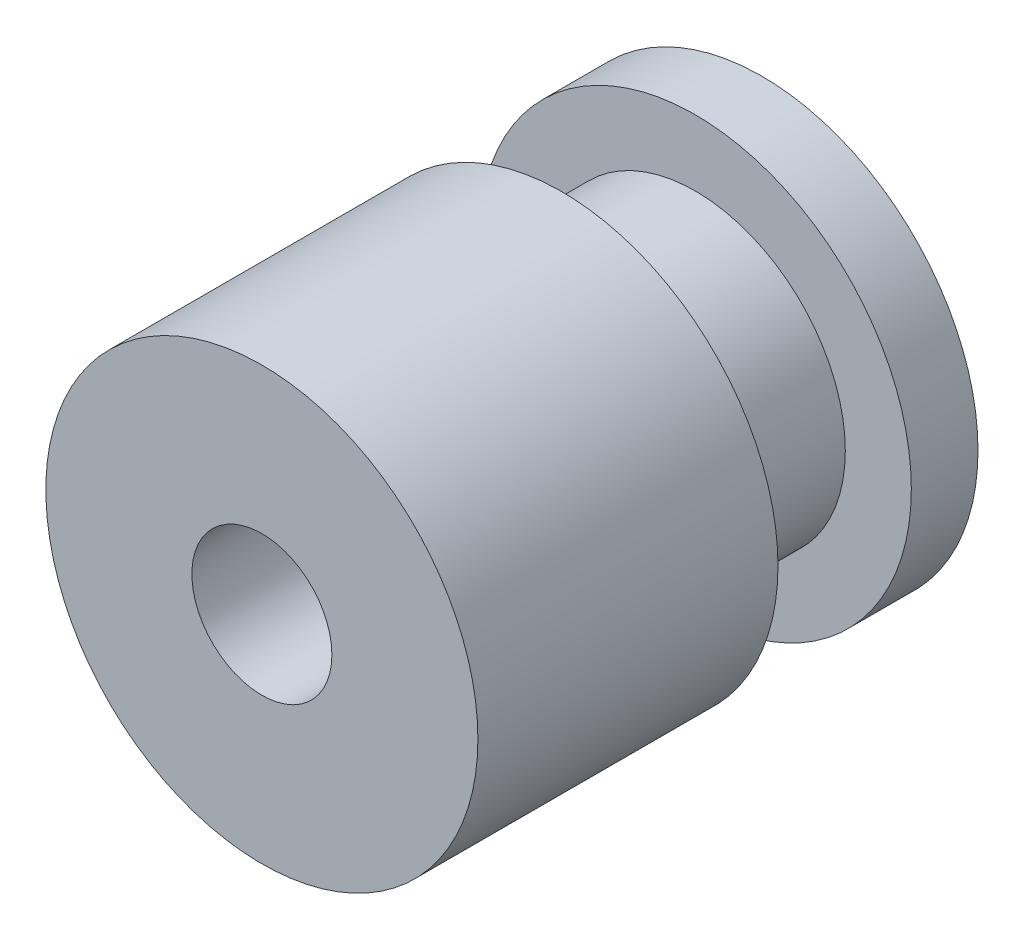
ISO-10303-21;
HEADER;
FILE_DESCRIPTION(('STEP AP214'),'2;1');
FILE_NAME('part.step','',(''),(''),'','','');
FILE_SCHEMA(('AUTOMOTIVE_DESIGN { 1 0 10303 214 1 1 1 1 }'));
ENDSEC;
DATA;
#1=APPLICATION_CONTEXT('core data for automotive mechanical design processes');
#2=APPLICATION_PROTOCOL_DEFINITION('international standard','automotive_design',2000,#1);
#3=PRODUCT_CONTEXT('',#1,'mechanical');
#4=PRODUCT('Part','Part','',(#3));
#5=PRODUCT_RELATED_PRODUCT_CATEGORY('part','',(#4));
#6=PRODUCT_DEFINITION_FORMATION('','',#4);
#7=PRODUCT_DEFINITION_CONTEXT('part definition',#1,'design');
#8=PRODUCT_DEFINITION('design','',#6,#7);
#9=PRODUCT_DEFINITION_SHAPE('','',#8);
#10=(LENGTH_UNIT() NAMED_UNIT(*) SI_UNIT(.MILLI.,.METRE.));
#11=(NAMED_UNIT(*) PLANE_ANGLE_UNIT() SI_UNIT($,.RADIAN.));
#12=(NAMED_UNIT(*) SI_UNIT($,.STERADIAN.) SOLID_ANGLE_UNIT());
#13=UNCERTAINTY_MEASURE_WITH_UNIT(LENGTH_MEASURE(1.E-05),#10,'distance_accuracy_value','');
#14=(GEOMETRIC_REPRESENTATION_CONTEXT(3) GLOBAL_UNCERTAINTY_ASSIGNED_CONTEXT((#13)) GLOBAL_UNIT_ASSIGNED_CONTEXT((#10,
#11,#12)) REPRESENTATION_CONTEXT('',''));
#15=CARTESIAN_POINT('',(0.,0.,0.));
#16=DIRECTION('',(0.,0.,1.));
#17=DIRECTION('',(1.,0.,0.));
#18=AXIS2_PLACEMENT_3D('',#15,#16,#17);
#19=CARTESIAN_POINT('',(6.48,0.,2.));
#20=DIRECTION('',(0.,0.,1.));
#21=DIRECTION('',(1.,0.,0.));
#22=AXIS2_PLACEMENT_3D('',#19,#20,#21);
#23=PLANE('',#22);
#24=CARTESIAN_POINT('',(0.,0.,2.));
#25=DIRECTION('',(0.,0.,1.));
#26=DIRECTION('',(1.,0.,0.));
#27=AXIS2_PLACEMENT_3D('',#24,#25,#26);
#28=CIRCLE('',#27,4.5);
#29=CARTESIAN_POINT('',(4.5,0.,2.));
#30=VERTEX_POINT('',#29);
#31=EDGE_CURVE('E63',#30,#30,#28,.T.);
#32=ORIENTED_EDGE('',*,*,#31,.F.);
#33=EDGE_LOOP('',(#32));
#34=FACE_BOUND('',#33,.T.);
#35=ADVANCED_FACE('F45',(#34),#23,.F.);
#36=CARTESIAN_POINT('',(0.,0.,7.6));
#37=DIRECTION('',(0.,0.,1.));
#38=DIRECTION('',(1.,0.,0.));
#39=AXIS2_PLACEMENT_3D('',#36,#37,#38);
#40=CONICAL_SURFACE('',#39,2.1,1.02974425867665);
#41=CARTESIAN_POINT('',(0.,0.,6.33819270004212));
#42=VERTEX_POINT('',#41);
#43=VERTEX_LOOP('',#42);
#44=FACE_BOUND('',#43,.T.);
#45=CARTESIAN_POINT('',(0.,0.,7.6));
#46=DIRECTION('',(0.,0.,1.));
#47=DIRECTION('',(1.,0.,0.));
#48=AXIS2_PLACEMENT_3D('',#45,#46,#47);
#49=CIRCLE('',#48,2.1);
#50=CARTESIAN_POINT('',(2.1,0.,7.6));
#51=VERTEX_POINT('',#50);
#52=EDGE_CURVE('E61',#51,#51,#49,.T.);
#53=ORIENTED_EDGE('',*,*,#52,.T.);
#54=EDGE_LOOP('',(#53));
#55=FACE_BOUND('',#54,.T.);
#56=ADVANCED_FACE('F54',(#44,#55),#40,.F.);
#57=CARTESIAN_POINT('',(0.,0.,15.));
#58=DIRECTION('',(0.,0.,1.));
#59=DIRECTION('',(1.,0.,0.));
#60=AXIS2_PLACEMENT_3D('',#57,#58,#59);
#61=CYLINDRICAL_SURFACE('',#60,2.09999999999999);
#62=ORIENTED_EDGE('',*,*,#52,.F.);
#63=EDGE_LOOP('',(#62));
#64=FACE_BOUND('',#63,.T.);
#65=CARTESIAN_POINT('',(0.,0.,15.));
#66=DIRECTION('',(0.,0.,1.));
#67=DIRECTION('',(1.,0.,0.));
#68=AXIS2_PLACEMENT_3D('',#65,#66,#67);
#69=CIRCLE('',#68,2.09999999999999);
#70=CARTESIAN_POINT('',(2.09999999999999,0.,15.));
#71=VERTEX_POINT('',#70);
#72=EDGE_CURVE('E64',#71,#71,#69,.T.);
#73=ORIENTED_EDGE('',*,*,#72,.T.);
#74=EDGE_LOOP('',(#73));
#75=FACE_BOUND('',#74,.T.);
#76=ADVANCED_FACE('F57',(#64,#75),#61,.F.);
#77=CARTESIAN_POINT('',(0.,0.,15.));
#78=DIRECTION('',(0.,0.,1.));
#79=DIRECTION('',(1.,0.,0.));
#80=AXIS2_PLACEMENT_3D('',#77,#78,#79);
#81=PLANE('',#80);
#82=ORIENTED_EDGE('',*,*,#72,.F.);
#83=EDGE_LOOP('',(#82));
#84=FACE_BOUND('',#83,.T.);
#85=CARTESIAN_POINT('',(0.,0.,15.));
#86=DIRECTION('',(0.,0.,1.));
#87=DIRECTION('',(1.,0.,0.));
#88=AXIS2_PLACEMENT_3D('',#85,#86,#87);
#89=CIRCLE('',#88,6.48);
#90=CARTESIAN_POINT('',(6.48,0.,15.));
#91=VERTEX_POINT('',#90);
#92=EDGE_CURVE('E13',#91,#91,#89,.T.);
#93=ORIENTED_EDGE('',*,*,#92,.T.);
#94=EDGE_LOOP('',(#93));
#95=FACE_BOUND('',#94,.T.);
#96=ADVANCED_FACE('F91',(#84,#95),#81,.T.);
#97=CARTESIAN_POINT('',(0.,0.,15.));
#98=DIRECTION('',(0.,0.,-1.));
#99=DIRECTION('',(-1.,0.,0.));
#100=AXIS2_PLACEMENT_3D('',#97,#98,#99);
#101=CYLINDRICAL_SURFACE('',#100,6.48);
#102=CARTESIAN_POINT('',(0.,0.,6.));
#103=DIRECTION('',(0.,0.,1.));
#104=DIRECTION('',(1.,0.,0.));
#105=AXIS2_PLACEMENT_3D('',#102,#103,#104);
#106=CIRCLE('',#105,6.48);
#107=CARTESIAN_POINT('',(6.48,0.,6.));
#108=VERTEX_POINT('',#107);
#109=EDGE_CURVE('E48',#108,#108,#106,.T.);
#110=ORIENTED_EDGE('',*,*,#109,.T.);
#111=EDGE_LOOP('',(#110));
#112=FACE_BOUND('',#111,.T.);
#113=ORIENTED_EDGE('',*,*,#92,.F.);
#114=EDGE_LOOP('',(#113));
#115=FACE_BOUND('',#114,.T.);
#116=ADVANCED_FACE('F78',(#112,#115),#101,.T.);
#117=CARTESIAN_POINT('',(0.,0.,6.));
#118=DIRECTION('',(0.,0.,1.));
#119=DIRECTION('',(1.,0.,0.));
#120=AXIS2_PLACEMENT_3D('',#117,#118,#119);
#121=PLANE('',#120);
#122=CARTESIAN_POINT('',(0.,0.,6.));
#123=DIRECTION('',(0.,0.,1.));
#124=DIRECTION('',(1.,0.,0.));
#125=AXIS2_PLACEMENT_3D('',#122,#123,#124);
#126=CIRCLE('',#125,4.5);
#127=CARTESIAN_POINT('',(4.5,0.,6.));
#128=VERTEX_POINT('',#127);
#129=EDGE_CURVE('E67',#128,#128,#126,.T.);
#130=ORIENTED_EDGE('',*,*,#129,.T.);
#131=EDGE_LOOP('',(#130));
#132=FACE_BOUND('',#131,.T.);
#133=ORIENTED_EDGE('',*,*,#109,.F.);
#134=EDGE_LOOP('',(#133));
#135=FACE_BOUND('',#134,.T.);
#136=ADVANCED_FACE('F81',(#132,#135),#121,.F.);
#137=CARTESIAN_POINT('',(0.,0.,6.));
#138=DIRECTION('',(0.,0.,-1.));
#139=DIRECTION('',(-1.,0.,0.));
#140=AXIS2_PLACEMENT_3D('',#137,#138,#139);
#141=CYLINDRICAL_SURFACE('',#140,4.5);
#142=ORIENTED_EDGE('',*,*,#129,.F.);
#143=EDGE_LOOP('',(#142));
#144=FACE_BOUND('',#143,.T.);
#145=ORIENTED_EDGE('',*,*,#31,.T.);
#146=EDGE_LOOP('',(#145));
#147=FACE_BOUND('',#146,.T.);
#148=ADVANCED_FACE('F83',(#144,#147),#141,.T.);
#149=CLOSED_SHELL('',(#35,#56,#76,#96,#116,#136,#148));
#150=MANIFOLD_SOLID_BREP('B2',#149);
#151=CARTESIAN_POINT('',(6.48,0.,2.));
#152=DIRECTION('',(0.,0.,1.));
#153=DIRECTION('',(1.,0.,0.));
#154=AXIS2_PLACEMENT_3D('',#151,#152,#153);
#155=PLANE('',#154);
#156=CARTESIAN_POINT('',(0.,0.,2.));
#157=DIRECTION('',(0.,0.,1.));
#158=DIRECTION('',(1.,0.,0.));
#159=AXIS2_PLACEMENT_3D('',#156,#157,#158);
#160=CIRCLE('',#159,6.48);
#161=CARTESIAN_POINT('',(6.48,0.,2.));
#162=VERTEX_POINT('',#161);
#163=EDGE_CURVE('E44',#162,#162,#160,.T.);
#164=ORIENTED_EDGE('',*,*,#163,.T.);
#165=EDGE_LOOP('',(#164));
#166=FACE_BOUND('',#165,.T.);
#167=ADVANCED_FACE('F151',(#166),#155,.T.);
#168=CARTESIAN_POINT('',(0.,0.,0.));
#169=DIRECTION('',(0.,0.,1.));
#170=DIRECTION('',(1.,0.,0.));
#171=AXIS2_PLACEMENT_3D('',#168,#169,#170);
#172=PLANE('',#171);
#173=CARTESIAN_POINT('',(0.,0.,0.));
#174=DIRECTION('',(0.,0.,1.));
#175=DIRECTION('',(1.,0.,0.));
#176=AXIS2_PLACEMENT_3D('',#173,#174,#175);
#177=CIRCLE('',#176,6.48);
#178=CARTESIAN_POINT('',(6.48,0.,0.));
#179=VERTEX_POINT('',#178);
#180=EDGE_CURVE('E155',#179,#179,#177,.T.);
#181=ORIENTED_EDGE('',*,*,#180,.F.);
#182=EDGE_LOOP('',(#181));
#183=FACE_BOUND('',#182,.T.);
#184=ADVANCED_FACE('F166',(#183),#172,.F.);
#185=CARTESIAN_POINT('',(0.,0.,15.));
#186=DIRECTION('',(0.,0.,-1.));
#187=DIRECTION('',(-1.,0.,0.));
#188=AXIS2_PLACEMENT_3D('',#185,#186,#187);
#189=CYLINDRICAL_SURFACE('',#188,6.48);
#190=ORIENTED_EDGE('',*,*,#180,.T.);
#191=EDGE_LOOP('',(#190));
#192=FACE_BOUND('',#191,.T.);
#193=ORIENTED_EDGE('',*,*,#163,.F.);
#194=EDGE_LOOP('',(#193));
#195=FACE_BOUND('',#194,.T.);
#196=ADVANCED_FACE('F153',(#192,#195),#189,.T.);
#197=CLOSED_SHELL('',(#167,#184,#196));
#198=MANIFOLD_SOLID_BREP('B7',#197);
#199=ADVANCED_BREP_SHAPE_REPRESENTATION('',(#18,#150,#198),#14);
#200=SHAPE_DEFINITION_REPRESENTATION(#9,#199);
ENDSEC;
END-ISO-10303-21;
